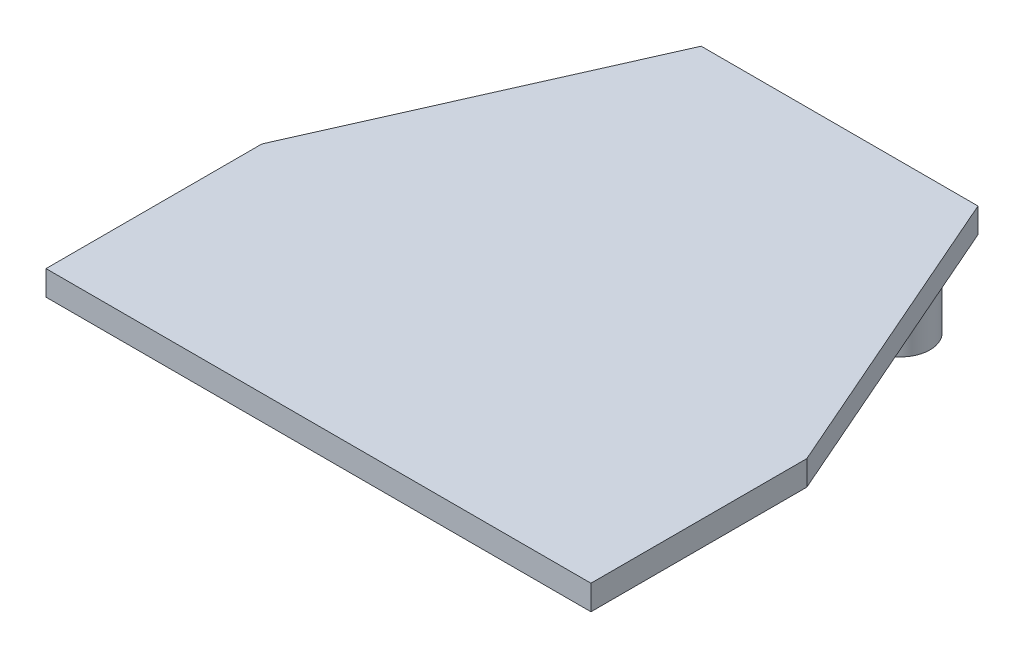
ISO-10303-21;
HEADER;
FILE_DESCRIPTION(('STEP AP214'),'2;1');
FILE_NAME('part.step','',(''),(''),'','','');
FILE_SCHEMA(('AUTOMOTIVE_DESIGN { 1 0 10303 214 1 1 1 1 }'));
ENDSEC;
DATA;
#1=APPLICATION_CONTEXT('core data for automotive mechanical design processes');
#2=APPLICATION_PROTOCOL_DEFINITION('international standard','automotive_design',2000,#1);
#3=PRODUCT_CONTEXT('',#1,'mechanical');
#4=PRODUCT('Part','Part','',(#3));
#5=PRODUCT_RELATED_PRODUCT_CATEGORY('part','',(#4));
#6=PRODUCT_DEFINITION_FORMATION('','',#4);
#7=PRODUCT_DEFINITION_CONTEXT('part definition',#1,'design');
#8=PRODUCT_DEFINITION('design','',#6,#7);
#9=PRODUCT_DEFINITION_SHAPE('','',#8);
#10=(LENGTH_UNIT() NAMED_UNIT(*) SI_UNIT(.MILLI.,.METRE.));
#11=(NAMED_UNIT(*) PLANE_ANGLE_UNIT() SI_UNIT($,.RADIAN.));
#12=(NAMED_UNIT(*) SI_UNIT($,.STERADIAN.) SOLID_ANGLE_UNIT());
#13=UNCERTAINTY_MEASURE_WITH_UNIT(LENGTH_MEASURE(1.E-05),#10,'distance_accuracy_value','');
#14=(GEOMETRIC_REPRESENTATION_CONTEXT(3) GLOBAL_UNCERTAINTY_ASSIGNED_CONTEXT((#13)) GLOBAL_UNIT_ASSIGNED_CONTEXT((#10,
#11,#12)) REPRESENTATION_CONTEXT('',''));
#15=CARTESIAN_POINT('',(0.,0.,0.));
#16=DIRECTION('',(0.,0.,1.));
#17=DIRECTION('',(1.,0.,0.));
#18=AXIS2_PLACEMENT_3D('',#15,#16,#17);
#19=CARTESIAN_POINT('',(-22.,2.,-8.71428571428616));
#20=DIRECTION('',(0.914096225507391,0.,0.405497337245439));
#21=DIRECTION('',(0.405497337245439,0.,-0.914096225507391));
#22=AXIS2_PLACEMENT_3D('',#19,#20,#21);
#23=PLANE('',#22);
#24=DIRECTION('',(-0.405497337245439,0.,0.914096225507391));
#25=VECTOR('',#24,1.);
#26=CARTESIAN_POINT('',(-22.,0.,-8.71428571428616));
#27=LINE('',#26,#25);
#28=CARTESIAN_POINT('',(-11.0999999999996,0.,-33.2857142857151));
#29=VERTEX_POINT('',#28);
#30=CARTESIAN_POINT('',(-22.,0.,-8.71428571428616));
#31=VERTEX_POINT('',#30);
#32=EDGE_CURVE('E117',#29,#31,#27,.T.);
#33=ORIENTED_EDGE('',*,*,#32,.T.);
#34=DIRECTION('',(0.,-1.,0.));
#35=VECTOR('',#34,1.);
#36=CARTESIAN_POINT('',(-22.,2.,-8.71428571428616));
#37=LINE('',#36,#35);
#38=CARTESIAN_POINT('',(-22.,2.,-8.71428571428616));
#39=VERTEX_POINT('',#38);
#40=EDGE_CURVE('E11',#39,#31,#37,.T.);
#41=ORIENTED_EDGE('',*,*,#40,.F.);
#42=DIRECTION('',(-0.405497337245439,0.,0.914096225507391));
#43=VECTOR('',#42,1.);
#44=CARTESIAN_POINT('',(-22.,2.,-8.71428571428616));
#45=LINE('',#44,#43);
#46=CARTESIAN_POINT('',(-11.0999999999996,2.,-33.2857142857151));
#47=VERTEX_POINT('',#46);
#48=EDGE_CURVE('E128',#47,#39,#45,.T.);
#49=ORIENTED_EDGE('',*,*,#48,.F.);
#50=DIRECTION('',(0.,-1.,0.));
#51=VECTOR('',#50,1.);
#52=CARTESIAN_POINT('',(-11.0999999999996,2.,-33.2857142857151));
#53=LINE('',#52,#51);
#54=EDGE_CURVE('E113',#47,#29,#53,.T.);
#55=ORIENTED_EDGE('',*,*,#54,.T.);
#56=EDGE_LOOP('',(#33,#41,#49,#55));
#57=FACE_BOUND('',#56,.T.);
#58=ADVANCED_FACE('F33',(#57),#23,.F.);
#59=CARTESIAN_POINT('',(-22.,2.,-8.71428571428616));
#60=DIRECTION('',(1.,0.,0.));
#61=DIRECTION('',(0.,0.,-1.));
#62=AXIS2_PLACEMENT_3D('',#59,#60,#61);
#63=PLANE('',#62);
#64=DIRECTION('',(0.,0.,1.));
#65=VECTOR('',#64,1.);
#66=CARTESIAN_POINT('',(-22.,0.,-8.71428571428616));
#67=LINE('',#66,#65);
#68=CARTESIAN_POINT('',(-22.,0.,8.71428571428616));
#69=VERTEX_POINT('',#68);
#70=EDGE_CURVE('E120',#31,#69,#67,.T.);
#71=ORIENTED_EDGE('',*,*,#70,.T.);
#72=DIRECTION('',(0.,-1.,0.));
#73=VECTOR('',#72,1.);
#74=CARTESIAN_POINT('',(-22.,2.,8.71428571428616));
#75=LINE('',#74,#73);
#76=CARTESIAN_POINT('',(-22.,2.,8.71428571428616));
#77=VERTEX_POINT('',#76);
#78=EDGE_CURVE('E41',#77,#69,#75,.T.);
#79=ORIENTED_EDGE('',*,*,#78,.F.);
#80=DIRECTION('',(0.,0.,1.));
#81=VECTOR('',#80,1.);
#82=CARTESIAN_POINT('',(-22.,2.,-8.71428571428616));
#83=LINE('',#82,#81);
#84=EDGE_CURVE('E86',#39,#77,#83,.T.);
#85=ORIENTED_EDGE('',*,*,#84,.F.);
#86=ORIENTED_EDGE('',*,*,#40,.T.);
#87=EDGE_LOOP('',(#71,#79,#85,#86));
#88=FACE_BOUND('',#87,.T.);
#89=ADVANCED_FACE('F152',(#88),#63,.F.);
#90=CARTESIAN_POINT('',(-22.,2.,8.71428571428616));
#91=DIRECTION('',(0.,0.,-1.));
#92=DIRECTION('',(-1.,0.,0.));
#93=AXIS2_PLACEMENT_3D('',#90,#91,#92);
#94=PLANE('',#93);
#95=DIRECTION('',(1.,0.,0.));
#96=VECTOR('',#95,1.);
#97=CARTESIAN_POINT('',(-22.,0.,8.71428571428616));
#98=LINE('',#97,#96);
#99=CARTESIAN_POINT('',(22.,0.,8.71428571428616));
#100=VERTEX_POINT('',#99);
#101=EDGE_CURVE('E123',#69,#100,#98,.T.);
#102=ORIENTED_EDGE('',*,*,#101,.T.);
#103=DIRECTION('',(0.,-1.,0.));
#104=VECTOR('',#103,1.);
#105=CARTESIAN_POINT('',(22.,2.,8.71428571428616));
#106=LINE('',#105,#104);
#107=CARTESIAN_POINT('',(22.,2.,8.71428571428616));
#108=VERTEX_POINT('',#107);
#109=EDGE_CURVE('E108',#108,#100,#106,.T.);
#110=ORIENTED_EDGE('',*,*,#109,.F.);
#111=DIRECTION('',(1.,0.,0.));
#112=VECTOR('',#111,1.);
#113=CARTESIAN_POINT('',(-22.,2.,8.71428571428616));
#114=LINE('',#113,#112);
#115=EDGE_CURVE('E99',#77,#108,#114,.T.);
#116=ORIENTED_EDGE('',*,*,#115,.F.);
#117=ORIENTED_EDGE('',*,*,#78,.T.);
#118=EDGE_LOOP('',(#102,#110,#116,#117));
#119=FACE_BOUND('',#118,.T.);
#120=ADVANCED_FACE('F134',(#119),#94,.F.);
#121=CARTESIAN_POINT('',(22.,2.,-8.71428571428616));
#122=DIRECTION('',(-1.,0.,0.));
#123=DIRECTION('',(0.,0.,1.));
#124=AXIS2_PLACEMENT_3D('',#121,#122,#123);
#125=PLANE('',#124);
#126=DIRECTION('',(0.,0.,-1.));
#127=VECTOR('',#126,1.);
#128=CARTESIAN_POINT('',(22.,0.,-8.71428571428616));
#129=LINE('',#128,#127);
#130=CARTESIAN_POINT('',(22.,0.,-8.71428571428616));
#131=VERTEX_POINT('',#130);
#132=EDGE_CURVE('E107',#100,#131,#129,.T.);
#133=ORIENTED_EDGE('',*,*,#132,.T.);
#134=DIRECTION('',(0.,-1.,0.));
#135=VECTOR('',#134,1.);
#136=CARTESIAN_POINT('',(22.,2.,-8.71428571428616));
#137=LINE('',#136,#135);
#138=CARTESIAN_POINT('',(22.,2.,-8.71428571428616));
#139=VERTEX_POINT('',#138);
#140=EDGE_CURVE('E104',#139,#131,#137,.T.);
#141=ORIENTED_EDGE('',*,*,#140,.F.);
#142=DIRECTION('',(0.,0.,-1.));
#143=VECTOR('',#142,1.);
#144=CARTESIAN_POINT('',(22.,2.,-8.71428571428616));
#145=LINE('',#144,#143);
#146=EDGE_CURVE('E93',#108,#139,#145,.T.);
#147=ORIENTED_EDGE('',*,*,#146,.F.);
#148=ORIENTED_EDGE('',*,*,#109,.T.);
#149=EDGE_LOOP('',(#133,#141,#147,#148));
#150=FACE_BOUND('',#149,.T.);
#151=ADVANCED_FACE('F105',(#150),#125,.F.);
#152=CARTESIAN_POINT('',(11.2499999999987,2.,-33.2857142857151));
#153=DIRECTION('',(-0.916157334902174,0.,0.400818834019742));
#154=DIRECTION('',(0.400818834019742,0.,0.916157334902174));
#155=AXIS2_PLACEMENT_3D('',#152,#153,#154);
#156=PLANE('',#155);
#157=DIRECTION('',(-0.400818834019742,0.,-0.916157334902174));
#158=VECTOR('',#157,1.);
#159=CARTESIAN_POINT('',(11.2499999999987,0.,-33.2857142857151));
#160=LINE('',#159,#158);
#161=CARTESIAN_POINT('',(11.2499999999987,0.,-33.2857142857151));
#162=VERTEX_POINT('',#161);
#163=EDGE_CURVE('E72',#131,#162,#160,.T.);
#164=ORIENTED_EDGE('',*,*,#163,.T.);
#165=DIRECTION('',(0.,-1.,0.));
#166=VECTOR('',#165,1.);
#167=CARTESIAN_POINT('',(11.2499999999987,2.,-33.2857142857151));
#168=LINE('',#167,#166);
#169=CARTESIAN_POINT('',(11.2499999999987,2.,-33.2857142857151));
#170=VERTEX_POINT('',#169);
#171=EDGE_CURVE('E109',#170,#162,#168,.T.);
#172=ORIENTED_EDGE('',*,*,#171,.F.);
#173=DIRECTION('',(-0.400818834019742,0.,-0.916157334902174));
#174=VECTOR('',#173,1.);
#175=CARTESIAN_POINT('',(11.2499999999987,2.,-33.2857142857151));
#176=LINE('',#175,#174);
#177=EDGE_CURVE('E97',#139,#170,#176,.T.);
#178=ORIENTED_EDGE('',*,*,#177,.F.);
#179=ORIENTED_EDGE('',*,*,#140,.T.);
#180=EDGE_LOOP('',(#164,#172,#178,#179));
#181=FACE_BOUND('',#180,.T.);
#182=ADVANCED_FACE('F111',(#181),#156,.F.);
#183=CARTESIAN_POINT('',(-11.0999999999996,2.,-33.2857142857151));
#184=DIRECTION('',(0.,0.,1.));
#185=DIRECTION('',(1.,0.,0.));
#186=AXIS2_PLACEMENT_3D('',#183,#184,#185);
#187=PLANE('',#186);
#188=DIRECTION('',(-1.,0.,0.));
#189=VECTOR('',#188,1.);
#190=CARTESIAN_POINT('',(-11.0999999999996,0.,-33.2857142857151));
#191=LINE('',#190,#189);
#192=EDGE_CURVE('E78',#162,#29,#191,.T.);
#193=ORIENTED_EDGE('',*,*,#192,.T.);
#194=ORIENTED_EDGE('',*,*,#54,.F.);
#195=DIRECTION('',(-1.,0.,0.));
#196=VECTOR('',#195,1.);
#197=CARTESIAN_POINT('',(-11.0999999999996,2.,-33.2857142857151));
#198=LINE('',#197,#196);
#199=EDGE_CURVE('E49',#170,#47,#198,.T.);
#200=ORIENTED_EDGE('',*,*,#199,.F.);
#201=ORIENTED_EDGE('',*,*,#171,.T.);
#202=EDGE_LOOP('',(#193,#194,#200,#201));
#203=FACE_BOUND('',#202,.T.);
#204=ADVANCED_FACE('F141',(#203),#187,.F.);
#205=CARTESIAN_POINT('',(0.,2.,0.));
#206=DIRECTION('',(0.,-1.,0.));
#207=DIRECTION('',(0.,0.,-1.));
#208=AXIS2_PLACEMENT_3D('',#205,#206,#207);
#209=PLANE('',#208);
#210=ORIENTED_EDGE('',*,*,#48,.T.);
#211=ORIENTED_EDGE('',*,*,#84,.T.);
#212=ORIENTED_EDGE('',*,*,#115,.T.);
#213=ORIENTED_EDGE('',*,*,#146,.T.);
#214=ORIENTED_EDGE('',*,*,#177,.T.);
#215=ORIENTED_EDGE('',*,*,#199,.T.);
#216=EDGE_LOOP('',(#210,#211,#212,#213,#214,#215));
#217=FACE_BOUND('',#216,.T.);
#218=ADVANCED_FACE('F95',(#217),#209,.F.);
#219=CARTESIAN_POINT('',(0.,0.,0.));
#220=DIRECTION('',(0.,-1.,0.));
#221=DIRECTION('',(0.,0.,-1.));
#222=AXIS2_PLACEMENT_3D('',#219,#220,#221);
#223=PLANE('',#222);
#224=CARTESIAN_POINT('',(10.0000000000004,0.,-3.28571428571514));
#225=DIRECTION('',(0.,-1.,0.));
#226=DIRECTION('',(0.,0.,-1.));
#227=AXIS2_PLACEMENT_3D('',#224,#225,#226);
#228=CIRCLE('',#227,2.37499999999996);
#229=CARTESIAN_POINT('',(10.0000000000004,0.,-5.66071428571511));
#230=VERTEX_POINT('',#229);
#231=EDGE_CURVE('E276',#230,#230,#228,.T.);
#232=ORIENTED_EDGE('',*,*,#231,.F.);
#233=EDGE_LOOP('',(#232));
#234=FACE_BOUND('',#233,.T.);
#235=CARTESIAN_POINT('',(10.0000000000004,0.,-28.2857142857151));
#236=DIRECTION('',(0.,-1.,0.));
#237=DIRECTION('',(0.,0.,-1.));
#238=AXIS2_PLACEMENT_3D('',#235,#236,#237);
#239=CIRCLE('',#238,2.37499999999997);
#240=CARTESIAN_POINT('',(10.0000000000004,0.,-30.6607142857151));
#241=VERTEX_POINT('',#240);
#242=EDGE_CURVE('E275',#241,#241,#239,.T.);
#243=ORIENTED_EDGE('',*,*,#242,.F.);
#244=EDGE_LOOP('',(#243));
#245=FACE_BOUND('',#244,.T.);
#246=CARTESIAN_POINT('',(-9.99157016781241,0.,-28.2644810292498));
#247=DIRECTION('',(0.,-1.,0.));
#248=DIRECTION('',(0.,0.,-1.));
#249=AXIS2_PLACEMENT_3D('',#246,#247,#248);
#250=CIRCLE('',#249,2.37284542078595);
#251=CARTESIAN_POINT('',(-9.99157016781241,0.,-30.6373264500357));
#252=VERTEX_POINT('',#251);
#253=EDGE_CURVE('E285',#252,#252,#250,.T.);
#254=ORIENTED_EDGE('',*,*,#253,.F.);
#255=EDGE_LOOP('',(#254));
#256=FACE_BOUND('',#255,.T.);
#257=CARTESIAN_POINT('',(-9.99999999999956,0.,-3.28571428571514));
#258=DIRECTION('',(0.,-1.,0.));
#259=DIRECTION('',(0.,0.,-1.));
#260=AXIS2_PLACEMENT_3D('',#257,#258,#259);
#261=CIRCLE('',#260,2.37499999999996);
#262=CARTESIAN_POINT('',(-9.99999999999956,0.,-5.66071428571511));
#263=VERTEX_POINT('',#262);
#264=EDGE_CURVE('E290',#263,#263,#261,.T.);
#265=ORIENTED_EDGE('',*,*,#264,.F.);
#266=EDGE_LOOP('',(#265));
#267=FACE_BOUND('',#266,.T.);
#268=ORIENTED_EDGE('',*,*,#32,.F.);
#269=ORIENTED_EDGE('',*,*,#192,.F.);
#270=ORIENTED_EDGE('',*,*,#163,.F.);
#271=ORIENTED_EDGE('',*,*,#132,.F.);
#272=ORIENTED_EDGE('',*,*,#101,.F.);
#273=ORIENTED_EDGE('',*,*,#70,.F.);
#274=EDGE_LOOP('',(#268,#269,#270,#271,#272,#273));
#275=FACE_BOUND('',#274,.T.);
#276=ADVANCED_FACE('F137',(#234,#245,#256,#267,#275),#223,.T.);
#277=CARTESIAN_POINT('',(-9.99999999999956,-5.,-3.28571428571514));
#278=DIRECTION('',(0.,1.,0.));
#279=DIRECTION('',(0.,0.,1.));
#280=AXIS2_PLACEMENT_3D('',#277,#278,#279);
#281=CYLINDRICAL_SURFACE('',#280,2.37499999999996);
#282=CARTESIAN_POINT('',(-9.99999999999956,-5.,-3.28571428571514));
#283=DIRECTION('',(0.,-1.,0.));
#284=DIRECTION('',(0.,0.,-1.));
#285=AXIS2_PLACEMENT_3D('',#282,#283,#284);
#286=CIRCLE('',#285,2.37499999999996);
#287=CARTESIAN_POINT('',(-9.99999999999956,-5.,-5.66071428571511));
#288=VERTEX_POINT('',#287);
#289=EDGE_CURVE('E121',#288,#288,#286,.T.);
#290=ORIENTED_EDGE('',*,*,#289,.F.);
#291=EDGE_LOOP('',(#290));
#292=FACE_BOUND('',#291,.T.);
#293=ORIENTED_EDGE('',*,*,#264,.T.);
#294=EDGE_LOOP('',(#293));
#295=FACE_BOUND('',#294,.T.);
#296=ADVANCED_FACE('F189',(#292,#295),#281,.T.);
#297=CARTESIAN_POINT('',(-9.99999999999956,-5.,-3.28571428571514));
#298=DIRECTION('',(0.,-1.,0.));
#299=DIRECTION('',(0.,0.,-1.));
#300=AXIS2_PLACEMENT_3D('',#297,#298,#299);
#301=PLANE('',#300);
#302=ORIENTED_EDGE('',*,*,#289,.T.);
#303=EDGE_LOOP('',(#302));
#304=FACE_BOUND('',#303,.T.);
#305=ADVANCED_FACE('F198',(#304),#301,.T.);
#306=CARTESIAN_POINT('',(-9.99157016781241,-5.,-28.2644810292498));
#307=DIRECTION('',(0.,1.,0.));
#308=DIRECTION('',(0.,0.,1.));
#309=AXIS2_PLACEMENT_3D('',#306,#307,#308);
#310=CYLINDRICAL_SURFACE('',#309,2.37284542078595);
#311=CARTESIAN_POINT('',(-9.99157016781241,-5.,-28.2644810292498));
#312=DIRECTION('',(0.,-1.,0.));
#313=DIRECTION('',(0.,0.,-1.));
#314=AXIS2_PLACEMENT_3D('',#311,#312,#313);
#315=CIRCLE('',#314,2.37284542078595);
#316=CARTESIAN_POINT('',(-9.99157016781241,-5.,-30.6373264500357));
#317=VERTEX_POINT('',#316);
#318=EDGE_CURVE('E287',#317,#317,#315,.T.);
#319=ORIENTED_EDGE('',*,*,#318,.F.);
#320=EDGE_LOOP('',(#319));
#321=FACE_BOUND('',#320,.T.);
#322=ORIENTED_EDGE('',*,*,#253,.T.);
#323=EDGE_LOOP('',(#322));
#324=FACE_BOUND('',#323,.T.);
#325=ADVANCED_FACE('F208',(#321,#324),#310,.T.);
#326=CARTESIAN_POINT('',(-9.99157016781241,-5.,-28.2644810292498));
#327=DIRECTION('',(0.,-1.,0.));
#328=DIRECTION('',(0.,0.,-1.));
#329=AXIS2_PLACEMENT_3D('',#326,#327,#328);
#330=PLANE('',#329);
#331=ORIENTED_EDGE('',*,*,#318,.T.);
#332=EDGE_LOOP('',(#331));
#333=FACE_BOUND('',#332,.T.);
#334=ADVANCED_FACE('F218',(#333),#330,.T.);
#335=CARTESIAN_POINT('',(10.0000000000004,-5.,-28.2857142857151));
#336=DIRECTION('',(0.,1.,0.));
#337=DIRECTION('',(0.,0.,1.));
#338=AXIS2_PLACEMENT_3D('',#335,#336,#337);
#339=CYLINDRICAL_SURFACE('',#338,2.37499999999997);
#340=CARTESIAN_POINT('',(10.0000000000004,-5.,-28.2857142857151));
#341=DIRECTION('',(0.,-1.,0.));
#342=DIRECTION('',(0.,0.,-1.));
#343=AXIS2_PLACEMENT_3D('',#340,#341,#342);
#344=CIRCLE('',#343,2.37499999999997);
#345=CARTESIAN_POINT('',(10.0000000000004,-5.,-30.6607142857151));
#346=VERTEX_POINT('',#345);
#347=EDGE_CURVE('E279',#346,#346,#344,.T.);
#348=ORIENTED_EDGE('',*,*,#347,.F.);
#349=EDGE_LOOP('',(#348));
#350=FACE_BOUND('',#349,.T.);
#351=ORIENTED_EDGE('',*,*,#242,.T.);
#352=EDGE_LOOP('',(#351));
#353=FACE_BOUND('',#352,.T.);
#354=ADVANCED_FACE('F228',(#350,#353),#339,.T.);
#355=CARTESIAN_POINT('',(10.0000000000004,-5.,-28.2857142857151));
#356=DIRECTION('',(0.,-1.,0.));
#357=DIRECTION('',(0.,0.,-1.));
#358=AXIS2_PLACEMENT_3D('',#355,#356,#357);
#359=PLANE('',#358);
#360=ORIENTED_EDGE('',*,*,#347,.T.);
#361=EDGE_LOOP('',(#360));
#362=FACE_BOUND('',#361,.T.);
#363=ADVANCED_FACE('F238',(#362),#359,.T.);
#364=CARTESIAN_POINT('',(10.0000000000004,-5.,-3.28571428571514));
#365=DIRECTION('',(0.,1.,0.));
#366=DIRECTION('',(0.,0.,1.));
#367=AXIS2_PLACEMENT_3D('',#364,#365,#366);
#368=CYLINDRICAL_SURFACE('',#367,2.37499999999996);
#369=CARTESIAN_POINT('',(10.0000000000004,-5.,-3.28571428571514));
#370=DIRECTION('',(0.,-1.,0.));
#371=DIRECTION('',(0.,0.,-1.));
#372=AXIS2_PLACEMENT_3D('',#369,#370,#371);
#373=CIRCLE('',#372,2.37499999999996);
#374=CARTESIAN_POINT('',(10.0000000000004,-5.,-5.66071428571511));
#375=VERTEX_POINT('',#374);
#376=EDGE_CURVE('E274',#375,#375,#373,.T.);
#377=ORIENTED_EDGE('',*,*,#376,.F.);
#378=EDGE_LOOP('',(#377));
#379=FACE_BOUND('',#378,.T.);
#380=ORIENTED_EDGE('',*,*,#231,.T.);
#381=EDGE_LOOP('',(#380));
#382=FACE_BOUND('',#381,.T.);
#383=ADVANCED_FACE('F248',(#379,#382),#368,.T.);
#384=CARTESIAN_POINT('',(10.0000000000004,-5.,-3.28571428571514));
#385=DIRECTION('',(0.,-1.,0.));
#386=DIRECTION('',(0.,0.,-1.));
#387=AXIS2_PLACEMENT_3D('',#384,#385,#386);
#388=PLANE('',#387);
#389=ORIENTED_EDGE('',*,*,#376,.T.);
#390=EDGE_LOOP('',(#389));
#391=FACE_BOUND('',#390,.T.);
#392=ADVANCED_FACE('F258',(#391),#388,.T.);
#393=CLOSED_SHELL('',(#58,#89,#120,#151,#182,#204,#218,#276,#296,#305,#325,#334,#354,#363,#383,#392));
#394=MANIFOLD_SOLID_BREP('B2',#393);
#395=ADVANCED_BREP_SHAPE_REPRESENTATION('',(#18,#394),#14);
#396=SHAPE_DEFINITION_REPRESENTATION(#9,#395);
ENDSEC;
END-ISO-10303-21;
